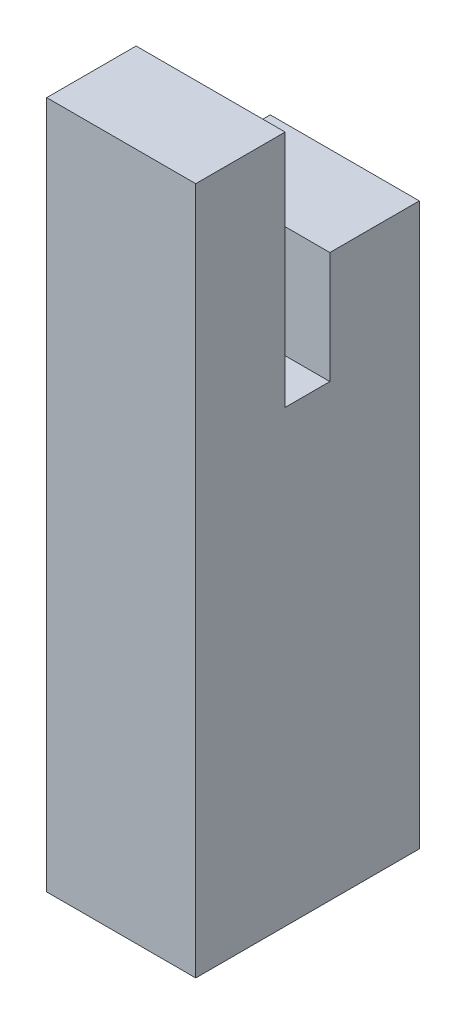
ISO-10303-21;
HEADER;
FILE_DESCRIPTION(('STEP AP214'),'2;1');
FILE_NAME('part.step','',(''),(''),'','','');
FILE_SCHEMA(('AUTOMOTIVE_DESIGN { 1 0 10303 214 1 1 1 1 }'));
ENDSEC;
DATA;
#1=APPLICATION_CONTEXT('core data for automotive mechanical design processes');
#2=APPLICATION_PROTOCOL_DEFINITION('international standard','automotive_design',2000,#1);
#3=PRODUCT_CONTEXT('',#1,'mechanical');
#4=PRODUCT('Part','Part','',(#3));
#5=PRODUCT_RELATED_PRODUCT_CATEGORY('part','',(#4));
#6=PRODUCT_DEFINITION_FORMATION('','',#4);
#7=PRODUCT_DEFINITION_CONTEXT('part definition',#1,'design');
#8=PRODUCT_DEFINITION('design','',#6,#7);
#9=PRODUCT_DEFINITION_SHAPE('','',#8);
#10=(LENGTH_UNIT() NAMED_UNIT(*) SI_UNIT(.MILLI.,.METRE.));
#11=(NAMED_UNIT(*) PLANE_ANGLE_UNIT() SI_UNIT($,.RADIAN.));
#12=(NAMED_UNIT(*) SI_UNIT($,.STERADIAN.) SOLID_ANGLE_UNIT());
#13=UNCERTAINTY_MEASURE_WITH_UNIT(LENGTH_MEASURE(1.E-05),#10,'distance_accuracy_value','');
#14=(GEOMETRIC_REPRESENTATION_CONTEXT(3) GLOBAL_UNCERTAINTY_ASSIGNED_CONTEXT((#13)) GLOBAL_UNIT_ASSIGNED_CONTEXT((#10,
#11,#12)) REPRESENTATION_CONTEXT('',''));
#15=CARTESIAN_POINT('',(0.,0.,0.));
#16=DIRECTION('',(0.,0.,1.));
#17=DIRECTION('',(1.,0.,0.));
#18=AXIS2_PLACEMENT_3D('',#15,#16,#17);
#19=CARTESIAN_POINT('',(0.,5.08,20.));
#20=DIRECTION('',(0.,-1.,0.));
#21=DIRECTION('',(0.,0.,-1.));
#22=AXIS2_PLACEMENT_3D('',#19,#20,#21);
#23=PLANE('',#22);
#24=DIRECTION('',(0.,0.,1.));
#25=VECTOR('',#24,1.);
#26=CARTESIAN_POINT('',(21.05,5.08,20.));
#27=LINE('',#26,#25);
#28=CARTESIAN_POINT('',(21.05,5.08,-17.47));
#29=VERTEX_POINT('',#28);
#30=CARTESIAN_POINT('',(21.05,5.08,-15.97));
#31=VERTEX_POINT('',#30);
#32=EDGE_CURVE('E277',#29,#31,#27,.T.);
#33=ORIENTED_EDGE('',*,*,#32,.F.);
#34=DIRECTION('',(1.,0.,0.));
#35=VECTOR('',#34,1.);
#36=CARTESIAN_POINT('',(21.05,5.08,-17.47));
#37=LINE('',#36,#35);
#38=CARTESIAN_POINT('',(16.05,5.08,-17.47));
#39=VERTEX_POINT('',#38);
#40=EDGE_CURVE('E280',#39,#29,#37,.T.);
#41=ORIENTED_EDGE('',*,*,#40,.F.);
#42=DIRECTION('',(0.,0.,-1.));
#43=VECTOR('',#42,1.);
#44=CARTESIAN_POINT('',(16.05,5.08,20.));
#45=LINE('',#44,#43);
#46=CARTESIAN_POINT('',(16.05,5.08,-15.97));
#47=VERTEX_POINT('',#46);
#48=EDGE_CURVE('E274',#47,#39,#45,.T.);
#49=ORIENTED_EDGE('',*,*,#48,.F.);
#50=DIRECTION('',(-1.,0.,0.));
#51=VECTOR('',#50,1.);
#52=CARTESIAN_POINT('',(21.05,5.08,-15.97));
#53=LINE('',#52,#51);
#54=EDGE_CURVE('E311',#31,#47,#53,.T.);
#55=ORIENTED_EDGE('',*,*,#54,.F.);
#56=EDGE_LOOP('',(#33,#41,#49,#55));
#57=FACE_BOUND('',#56,.T.);
#58=ADVANCED_FACE('F177',(#57),#23,.F.);
#59=CARTESIAN_POINT('',(21.05,13.08,-15.97));
#60=DIRECTION('',(-1.,0.,0.));
#61=DIRECTION('',(0.,0.,1.));
#62=AXIS2_PLACEMENT_3D('',#59,#60,#61);
#63=PLANE('',#62);
#64=DIRECTION('',(0.,-1.,0.));
#65=VECTOR('',#64,1.);
#66=CARTESIAN_POINT('',(21.05,13.08,-12.97));
#67=LINE('',#66,#65);
#68=CARTESIAN_POINT('',(21.05,13.08,-12.97));
#69=VERTEX_POINT('',#68);
#70=CARTESIAN_POINT('',(21.05,-10.,-12.97));
#71=VERTEX_POINT('',#70);
#72=EDGE_CURVE('E242',#69,#71,#67,.T.);
#73=ORIENTED_EDGE('',*,*,#72,.T.);
#74=DIRECTION('',(0.,0.,1.));
#75=VECTOR('',#74,1.);
#76=CARTESIAN_POINT('',(21.05,-10.,-20.47));
#77=LINE('',#76,#75);
#78=CARTESIAN_POINT('',(21.05,-10.,-20.47));
#79=VERTEX_POINT('',#78);
#80=EDGE_CURVE('E247',#79,#71,#77,.T.);
#81=ORIENTED_EDGE('',*,*,#80,.F.);
#82=DIRECTION('',(0.,-1.,0.));
#83=VECTOR('',#82,1.);
#84=CARTESIAN_POINT('',(21.05,8.83,-20.47));
#85=LINE('',#84,#83);
#86=CARTESIAN_POINT('',(21.05,8.83,-20.47));
#87=VERTEX_POINT('',#86);
#88=EDGE_CURVE('E308',#87,#79,#85,.T.);
#89=ORIENTED_EDGE('',*,*,#88,.F.);
#90=DIRECTION('',(0.,0.,-1.));
#91=VECTOR('',#90,1.);
#92=CARTESIAN_POINT('',(21.05,8.83,-17.47));
#93=LINE('',#92,#91);
#94=CARTESIAN_POINT('',(21.05,8.83,-17.47));
#95=VERTEX_POINT('',#94);
#96=EDGE_CURVE('E281',#95,#87,#93,.T.);
#97=ORIENTED_EDGE('',*,*,#96,.F.);
#98=DIRECTION('',(0.,-1.,0.));
#99=VECTOR('',#98,1.);
#100=CARTESIAN_POINT('',(21.05,8.83,-17.47));
#101=LINE('',#100,#99);
#102=EDGE_CURVE('E294',#95,#29,#101,.T.);
#103=ORIENTED_EDGE('',*,*,#102,.T.);
#104=ORIENTED_EDGE('',*,*,#32,.T.);
#105=DIRECTION('',(0.,-1.,0.));
#106=VECTOR('',#105,1.);
#107=CARTESIAN_POINT('',(21.05,13.08,-15.97));
#108=LINE('',#107,#106);
#109=CARTESIAN_POINT('',(21.05,13.08,-15.97));
#110=VERTEX_POINT('',#109);
#111=EDGE_CURVE('E12',#110,#31,#108,.T.);
#112=ORIENTED_EDGE('',*,*,#111,.F.);
#113=DIRECTION('',(0.,0.,-1.));
#114=VECTOR('',#113,1.);
#115=CARTESIAN_POINT('',(21.05,13.08,-15.97));
#116=LINE('',#115,#114);
#117=EDGE_CURVE('E249',#69,#110,#116,.T.);
#118=ORIENTED_EDGE('',*,*,#117,.F.);
#119=EDGE_LOOP('',(#73,#81,#89,#97,#103,#104,#112,#118));
#120=FACE_BOUND('',#119,.T.);
#121=ADVANCED_FACE('F244',(#120),#63,.F.);
#122=CARTESIAN_POINT('',(21.05,13.08,-15.97));
#123=DIRECTION('',(0.,0.,1.));
#124=DIRECTION('',(1.,0.,0.));
#125=AXIS2_PLACEMENT_3D('',#122,#123,#124);
#126=PLANE('',#125);
#127=ORIENTED_EDGE('',*,*,#54,.T.);
#128=DIRECTION('',(0.,-1.,0.));
#129=VECTOR('',#128,1.);
#130=CARTESIAN_POINT('',(16.05,13.08,-15.97));
#131=LINE('',#130,#129);
#132=CARTESIAN_POINT('',(16.05,13.08,-15.97));
#133=VERTEX_POINT('',#132);
#134=EDGE_CURVE('E185',#133,#47,#131,.T.);
#135=ORIENTED_EDGE('',*,*,#134,.F.);
#136=DIRECTION('',(-1.,0.,0.));
#137=VECTOR('',#136,1.);
#138=CARTESIAN_POINT('',(21.05,13.08,-15.97));
#139=LINE('',#138,#137);
#140=EDGE_CURVE('E314',#110,#133,#139,.T.);
#141=ORIENTED_EDGE('',*,*,#140,.F.);
#142=ORIENTED_EDGE('',*,*,#111,.T.);
#143=EDGE_LOOP('',(#127,#135,#141,#142));
#144=FACE_BOUND('',#143,.T.);
#145=ADVANCED_FACE('F333',(#144),#126,.F.);
#146=CARTESIAN_POINT('',(16.05,13.08,-15.97));
#147=DIRECTION('',(1.,0.,0.));
#148=DIRECTION('',(0.,0.,-1.));
#149=AXIS2_PLACEMENT_3D('',#146,#147,#148);
#150=PLANE('',#149);
#151=ORIENTED_EDGE('',*,*,#134,.T.);
#152=ORIENTED_EDGE('',*,*,#48,.T.);
#153=DIRECTION('',(0.,-1.,0.));
#154=VECTOR('',#153,1.);
#155=CARTESIAN_POINT('',(16.05,8.83,-17.47));
#156=LINE('',#155,#154);
#157=CARTESIAN_POINT('',(16.05,8.83,-17.47));
#158=VERTEX_POINT('',#157);
#159=EDGE_CURVE('E301',#158,#39,#156,.T.);
#160=ORIENTED_EDGE('',*,*,#159,.F.);
#161=DIRECTION('',(0.,0.,1.));
#162=VECTOR('',#161,1.);
#163=CARTESIAN_POINT('',(16.05,8.83,-17.47));
#164=LINE('',#163,#162);
#165=CARTESIAN_POINT('',(16.05,8.83,-20.47));
#166=VERTEX_POINT('',#165);
#167=EDGE_CURVE('E288',#166,#158,#164,.T.);
#168=ORIENTED_EDGE('',*,*,#167,.F.);
#169=DIRECTION('',(0.,-1.,0.));
#170=VECTOR('',#169,1.);
#171=CARTESIAN_POINT('',(16.05,8.83,-20.47));
#172=LINE('',#171,#170);
#173=CARTESIAN_POINT('',(16.05,-10.,-20.47));
#174=VERTEX_POINT('',#173);
#175=EDGE_CURVE('E305',#166,#174,#172,.T.);
#176=ORIENTED_EDGE('',*,*,#175,.T.);
#177=DIRECTION('',(0.,0.,-1.));
#178=VECTOR('',#177,1.);
#179=CARTESIAN_POINT('',(16.05,-10.,-20.47));
#180=LINE('',#179,#178);
#181=CARTESIAN_POINT('',(16.05,-10.,-12.97));
#182=VERTEX_POINT('',#181);
#183=EDGE_CURVE('E261',#182,#174,#180,.T.);
#184=ORIENTED_EDGE('',*,*,#183,.F.);
#185=DIRECTION('',(0.,-1.,0.));
#186=VECTOR('',#185,1.);
#187=CARTESIAN_POINT('',(16.05,13.08,-12.97));
#188=LINE('',#187,#186);
#189=CARTESIAN_POINT('',(16.05,13.08,-12.97));
#190=VERTEX_POINT('',#189);
#191=EDGE_CURVE('E252',#190,#182,#188,.T.);
#192=ORIENTED_EDGE('',*,*,#191,.F.);
#193=DIRECTION('',(0.,0.,1.));
#194=VECTOR('',#193,1.);
#195=CARTESIAN_POINT('',(16.05,13.08,-15.97));
#196=LINE('',#195,#194);
#197=EDGE_CURVE('E197',#133,#190,#196,.T.);
#198=ORIENTED_EDGE('',*,*,#197,.F.);
#199=EDGE_LOOP('',(#151,#152,#160,#168,#176,#184,#192,#198));
#200=FACE_BOUND('',#199,.T.);
#201=ADVANCED_FACE('F329',(#200),#150,.F.);
#202=CARTESIAN_POINT('',(21.05,13.08,-12.97));
#203=DIRECTION('',(0.,0.,-1.));
#204=DIRECTION('',(-1.,0.,0.));
#205=AXIS2_PLACEMENT_3D('',#202,#203,#204);
#206=PLANE('',#205);
#207=ORIENTED_EDGE('',*,*,#191,.T.);
#208=DIRECTION('',(-1.,0.,0.));
#209=VECTOR('',#208,1.);
#210=CARTESIAN_POINT('',(21.05,-10.,-12.97));
#211=LINE('',#210,#209);
#212=EDGE_CURVE('E255',#71,#182,#211,.T.);
#213=ORIENTED_EDGE('',*,*,#212,.F.);
#214=ORIENTED_EDGE('',*,*,#72,.F.);
#215=DIRECTION('',(1.,0.,0.));
#216=VECTOR('',#215,1.);
#217=CARTESIAN_POINT('',(21.05,13.08,-12.97));
#218=LINE('',#217,#216);
#219=EDGE_CURVE('E192',#190,#69,#218,.T.);
#220=ORIENTED_EDGE('',*,*,#219,.F.);
#221=EDGE_LOOP('',(#207,#213,#214,#220));
#222=FACE_BOUND('',#221,.T.);
#223=ADVANCED_FACE('F256',(#222),#206,.F.);
#224=CARTESIAN_POINT('',(0.,13.08,0.));
#225=DIRECTION('',(0.,-1.,0.));
#226=DIRECTION('',(0.,0.,-1.));
#227=AXIS2_PLACEMENT_3D('',#224,#225,#226);
#228=PLANE('',#227);
#229=ORIENTED_EDGE('',*,*,#117,.T.);
#230=ORIENTED_EDGE('',*,*,#140,.T.);
#231=ORIENTED_EDGE('',*,*,#197,.T.);
#232=ORIENTED_EDGE('',*,*,#219,.T.);
#233=EDGE_LOOP('',(#229,#230,#231,#232));
#234=FACE_BOUND('',#233,.T.);
#235=ADVANCED_FACE('F348',(#234),#228,.F.);
#236=CARTESIAN_POINT('',(21.05,8.83,-20.47));
#237=DIRECTION('',(0.,0.,1.));
#238=DIRECTION('',(1.,0.,0.));
#239=AXIS2_PLACEMENT_3D('',#236,#237,#238);
#240=PLANE('',#239);
#241=ORIENTED_EDGE('',*,*,#88,.T.);
#242=DIRECTION('',(1.,0.,0.));
#243=VECTOR('',#242,1.);
#244=CARTESIAN_POINT('',(21.05,-10.,-20.47));
#245=LINE('',#244,#243);
#246=EDGE_CURVE('E266',#174,#79,#245,.T.);
#247=ORIENTED_EDGE('',*,*,#246,.F.);
#248=ORIENTED_EDGE('',*,*,#175,.F.);
#249=DIRECTION('',(-1.,0.,0.));
#250=VECTOR('',#249,1.);
#251=CARTESIAN_POINT('',(21.05,8.83,-20.47));
#252=LINE('',#251,#250);
#253=EDGE_CURVE('E285',#87,#166,#252,.T.);
#254=ORIENTED_EDGE('',*,*,#253,.F.);
#255=EDGE_LOOP('',(#241,#247,#248,#254));
#256=FACE_BOUND('',#255,.T.);
#257=ADVANCED_FACE('F346',(#256),#240,.F.);
#258=CARTESIAN_POINT('',(21.05,8.83,-17.47));
#259=DIRECTION('',(0.,0.,-1.));
#260=DIRECTION('',(-1.,0.,0.));
#261=AXIS2_PLACEMENT_3D('',#258,#259,#260);
#262=PLANE('',#261);
#263=ORIENTED_EDGE('',*,*,#40,.T.);
#264=ORIENTED_EDGE('',*,*,#102,.F.);
#265=DIRECTION('',(1.,0.,0.));
#266=VECTOR('',#265,1.);
#267=CARTESIAN_POINT('',(21.05,8.83,-17.47));
#268=LINE('',#267,#266);
#269=EDGE_CURVE('E291',#158,#95,#268,.T.);
#270=ORIENTED_EDGE('',*,*,#269,.F.);
#271=ORIENTED_EDGE('',*,*,#159,.T.);
#272=EDGE_LOOP('',(#263,#264,#270,#271));
#273=FACE_BOUND('',#272,.T.);
#274=ADVANCED_FACE('F339',(#273),#262,.F.);
#275=CARTESIAN_POINT('',(0.,8.83,0.));
#276=DIRECTION('',(0.,1.,0.));
#277=DIRECTION('',(0.,0.,1.));
#278=AXIS2_PLACEMENT_3D('',#275,#276,#277);
#279=PLANE('',#278);
#280=ORIENTED_EDGE('',*,*,#96,.T.);
#281=ORIENTED_EDGE('',*,*,#253,.T.);
#282=ORIENTED_EDGE('',*,*,#167,.T.);
#283=ORIENTED_EDGE('',*,*,#269,.T.);
#284=EDGE_LOOP('',(#280,#281,#282,#283));
#285=FACE_BOUND('',#284,.T.);
#286=ADVANCED_FACE('F343',(#285),#279,.T.);
#287=CARTESIAN_POINT('',(0.,-10.,0.));
#288=DIRECTION('',(0.,-1.,0.));
#289=DIRECTION('',(0.,0.,-1.));
#290=AXIS2_PLACEMENT_3D('',#287,#288,#289);
#291=PLANE('',#290);
#292=ORIENTED_EDGE('',*,*,#80,.T.);
#293=ORIENTED_EDGE('',*,*,#212,.T.);
#294=ORIENTED_EDGE('',*,*,#183,.T.);
#295=ORIENTED_EDGE('',*,*,#246,.T.);
#296=EDGE_LOOP('',(#292,#293,#294,#295));
#297=FACE_BOUND('',#296,.T.);
#298=ADVANCED_FACE('F264',(#297),#291,.T.);
#299=CLOSED_SHELL('',(#58,#121,#145,#201,#223,#235,#257,#274,#286,#298));
#300=MANIFOLD_SOLID_BREP('B2',#299);
#301=ADVANCED_BREP_SHAPE_REPRESENTATION('',(#18,#300),#14);
#302=SHAPE_DEFINITION_REPRESENTATION(#9,#301);
ENDSEC;
END-ISO-10303-21;
